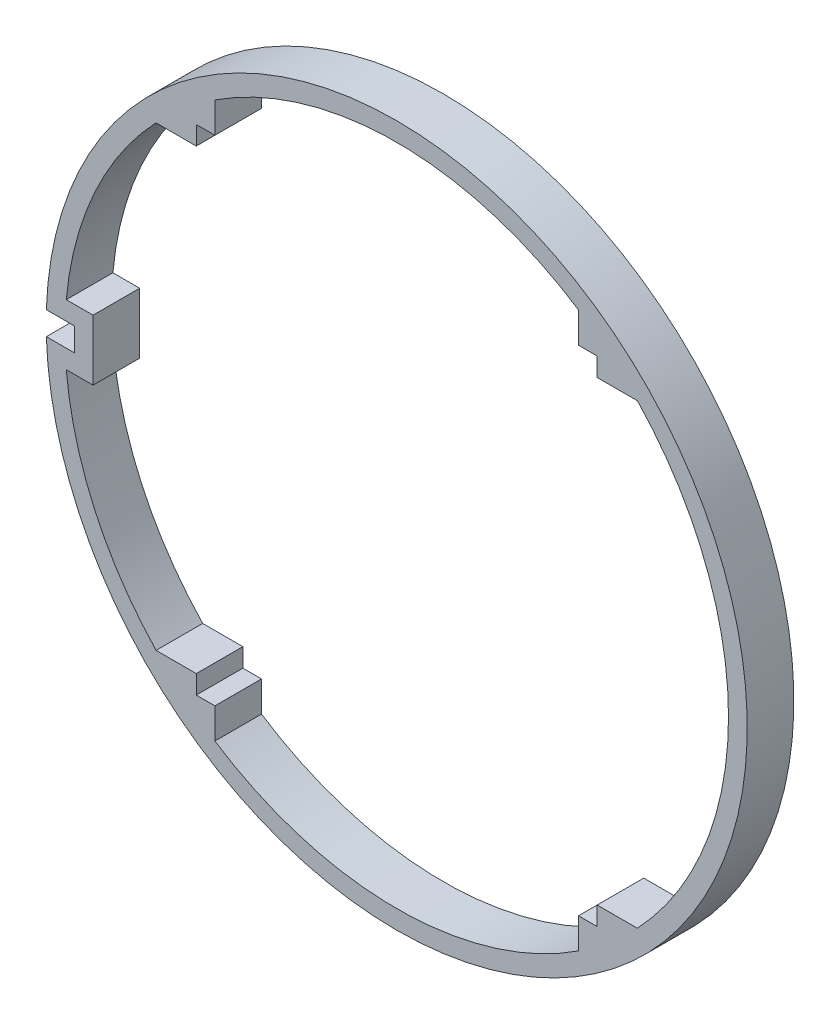
ISO-10303-21;
HEADER;
FILE_DESCRIPTION(('STEP AP214'),'2;1');
FILE_NAME('part.step','',(''),(''),'','','');
FILE_SCHEMA(('AUTOMOTIVE_DESIGN { 1 0 10303 214 1 1 1 1 }'));
ENDSEC;
DATA;
#1=APPLICATION_CONTEXT('core data for automotive mechanical design processes');
#2=APPLICATION_PROTOCOL_DEFINITION('international standard','automotive_design',2000,#1);
#3=PRODUCT_CONTEXT('',#1,'mechanical');
#4=PRODUCT('Part','Part','',(#3));
#5=PRODUCT_RELATED_PRODUCT_CATEGORY('part','',(#4));
#6=PRODUCT_DEFINITION_FORMATION('','',#4);
#7=PRODUCT_DEFINITION_CONTEXT('part definition',#1,'design');
#8=PRODUCT_DEFINITION('design','',#6,#7);
#9=PRODUCT_DEFINITION_SHAPE('','',#8);
#10=(LENGTH_UNIT() NAMED_UNIT(*) SI_UNIT(.MILLI.,.METRE.));
#11=(NAMED_UNIT(*) PLANE_ANGLE_UNIT() SI_UNIT($,.RADIAN.));
#12=(NAMED_UNIT(*) SI_UNIT($,.STERADIAN.) SOLID_ANGLE_UNIT());
#13=UNCERTAINTY_MEASURE_WITH_UNIT(LENGTH_MEASURE(1.E-05),#10,'distance_accuracy_value','');
#14=(GEOMETRIC_REPRESENTATION_CONTEXT(3) GLOBAL_UNCERTAINTY_ASSIGNED_CONTEXT((#13)) GLOBAL_UNIT_ASSIGNED_CONTEXT((#10,
#11,#12)) REPRESENTATION_CONTEXT('',''));
#15=CARTESIAN_POINT('',(0.,0.,0.));
#16=DIRECTION('',(0.,0.,1.));
#17=DIRECTION('',(1.,0.,0.));
#18=AXIS2_PLACEMENT_3D('',#15,#16,#17);
#19=CARTESIAN_POINT('',(0.,0.,10.));
#20=DIRECTION('',(0.,0.,-1.));
#21=DIRECTION('',(-1.,0.,0.));
#22=AXIS2_PLACEMENT_3D('',#19,#20,#21);
#23=CYLINDRICAL_SURFACE('',#22,71.1831196766441);
#24=CARTESIAN_POINT('',(0.,0.,0.));
#25=DIRECTION('',(0.,0.,1.));
#26=DIRECTION('',(1.,0.,0.));
#27=AXIS2_PLACEMENT_3D('',#24,#25,#26);
#28=CIRCLE('',#27,71.1831196766441);
#29=CARTESIAN_POINT('',(51.6197854605754,-49.0146332833737,0.));
#30=VERTEX_POINT('',#29);
#31=CARTESIAN_POINT('',(51.647559231169,48.985366716626,0.));
#32=VERTEX_POINT('',#31);
#33=EDGE_CURVE('E565',#30,#32,#28,.T.);
#34=ORIENTED_EDGE('',*,*,#33,.F.);
#35=DIRECTION('',(0.,0.,-1.));
#36=VECTOR('',#35,1.);
#37=CARTESIAN_POINT('',(51.6197854605754,-49.0146332833737,10.));
#38=LINE('',#37,#36);
#39=CARTESIAN_POINT('',(51.6197854605754,-49.0146332833737,10.));
#40=VERTEX_POINT('',#39);
#41=EDGE_CURVE('E12',#30,#40,#38,.F.);
#42=ORIENTED_EDGE('',*,*,#41,.T.);
#43=CARTESIAN_POINT('',(0.,0.,10.));
#44=DIRECTION('',(0.,0.,1.));
#45=DIRECTION('',(1.,0.,0.));
#46=AXIS2_PLACEMENT_3D('',#43,#44,#45);
#47=CIRCLE('',#46,71.1831196766441);
#48=CARTESIAN_POINT('',(51.647559231169,48.985366716626,10.));
#49=VERTEX_POINT('',#48);
#50=EDGE_CURVE('E582',#40,#49,#47,.T.);
#51=ORIENTED_EDGE('',*,*,#50,.T.);
#52=DIRECTION('',(0.,0.,-1.));
#53=VECTOR('',#52,1.);
#54=CARTESIAN_POINT('',(51.647559231169,48.985366716626,10.));
#55=LINE('',#54,#53);
#56=EDGE_CURVE('E532',#32,#49,#55,.F.);
#57=ORIENTED_EDGE('',*,*,#56,.F.);
#58=EDGE_LOOP('',(#34,#42,#51,#57));
#59=FACE_BOUND('',#58,.T.);
#60=ADVANCED_FACE('F76',(#59),#23,.F.);
#61=DIRECTION('',(0.,0.,-1.));
#62=VECTOR('',#61,1.);
#63=CARTESIAN_POINT('',(38.9999475409813,59.5486407796194,10.));
#64=LINE('',#63,#62);
#65=CARTESIAN_POINT('',(38.9999475409813,59.5486407796194,10.));
#66=VERTEX_POINT('',#65);
#67=CARTESIAN_POINT('',(38.9999475409813,59.5486407796194,0.));
#68=VERTEX_POINT('',#67);
#69=EDGE_CURVE('E101',#66,#68,#64,.T.);
#70=ORIENTED_EDGE('',*,*,#69,.F.);
#71=CARTESIAN_POINT('',(-39.0000524590183,59.5485720659467,10.));
#72=VERTEX_POINT('',#71);
#73=EDGE_CURVE('E577',#66,#72,#47,.T.);
#74=ORIENTED_EDGE('',*,*,#73,.T.);
#75=DIRECTION('',(0.,0.,-1.));
#76=VECTOR('',#75,1.);
#77=CARTESIAN_POINT('',(-39.0000524590183,59.5485720659467,10.));
#78=LINE('',#77,#76);
#79=CARTESIAN_POINT('',(-39.0000524590183,59.5485720659467,0.));
#80=VERTEX_POINT('',#79);
#81=EDGE_CURVE('E530',#80,#72,#78,.F.);
#82=ORIENTED_EDGE('',*,*,#81,.F.);
#83=EDGE_CURVE('E562',#68,#80,#28,.T.);
#84=ORIENTED_EDGE('',*,*,#83,.F.);
#85=EDGE_LOOP('',(#70,#74,#82,#84));
#86=FACE_BOUND('',#85,.T.);
#87=ADVANCED_FACE('F625',(#86),#23,.F.);
#88=DIRECTION('',(0.,0.,-1.));
#89=VECTOR('',#88,1.);
#90=CARTESIAN_POINT('',(-51.647559231169,48.985366716626,10.));
#91=LINE('',#90,#89);
#92=CARTESIAN_POINT('',(-51.647559231169,48.985366716626,10.));
#93=VERTEX_POINT('',#92);
#94=CARTESIAN_POINT('',(-51.647559231169,48.985366716626,0.));
#95=VERTEX_POINT('',#94);
#96=EDGE_CURVE('E91',#93,#95,#91,.T.);
#97=ORIENTED_EDGE('',*,*,#96,.F.);
#98=CARTESIAN_POINT('',(-70.8854542693566,6.50299161358703,10.));
#99=VERTEX_POINT('',#98);
#100=EDGE_CURVE('E269',#93,#99,#47,.T.);
#101=ORIENTED_EDGE('',*,*,#100,.T.);
#102=DIRECTION('',(0.,0.,-1.));
#103=VECTOR('',#102,1.);
#104=CARTESIAN_POINT('',(-70.8854542693566,6.50299161358703,10.));
#105=LINE('',#104,#103);
#106=CARTESIAN_POINT('',(-70.8854542693566,6.50299161358703,0.));
#107=VERTEX_POINT('',#106);
#108=EDGE_CURVE('E475',#99,#107,#105,.T.);
#109=ORIENTED_EDGE('',*,*,#108,.T.);
#110=EDGE_CURVE('E429',#95,#107,#28,.T.);
#111=ORIENTED_EDGE('',*,*,#110,.F.);
#112=EDGE_LOOP('',(#97,#101,#109,#111));
#113=FACE_BOUND('',#112,.T.);
#114=ADVANCED_FACE('F580',(#113),#23,.F.);
#115=DIRECTION('',(0.,0.,-1.));
#116=VECTOR('',#115,1.);
#117=CARTESIAN_POINT('',(38.9999475409813,-59.5486407796194,10.));
#118=LINE('',#117,#116);
#119=CARTESIAN_POINT('',(38.9999475409813,-59.5486407796194,0.));
#120=VERTEX_POINT('',#119);
#121=CARTESIAN_POINT('',(38.9999475409813,-59.5486407796194,10.));
#122=VERTEX_POINT('',#121);
#123=EDGE_CURVE('E88',#120,#122,#118,.F.);
#124=ORIENTED_EDGE('',*,*,#123,.F.);
#125=CARTESIAN_POINT('',(-39.0000524590183,-59.5485720659468,0.));
#126=VERTEX_POINT('',#125);
#127=EDGE_CURVE('E455',#126,#120,#28,.T.);
#128=ORIENTED_EDGE('',*,*,#127,.F.);
#129=DIRECTION('',(0.,0.,-1.));
#130=VECTOR('',#129,1.);
#131=CARTESIAN_POINT('',(-39.0000524590183,-59.5485720659468,10.));
#132=LINE('',#131,#130);
#133=CARTESIAN_POINT('',(-39.0000524590183,-59.5485720659468,10.));
#134=VERTEX_POINT('',#133);
#135=EDGE_CURVE('E522',#126,#134,#132,.F.);
#136=ORIENTED_EDGE('',*,*,#135,.T.);
#137=EDGE_CURVE('E436',#134,#122,#47,.T.);
#138=ORIENTED_EDGE('',*,*,#137,.T.);
#139=EDGE_LOOP('',(#124,#128,#136,#138));
#140=FACE_BOUND('',#139,.T.);
#141=ADVANCED_FACE('F590',(#140),#23,.F.);
#142=CARTESIAN_POINT('',(-70.8856259454272,-6.50111999769365,10.));
#143=VERTEX_POINT('',#142);
#144=CARTESIAN_POINT('',(-51.6197854605754,-49.0146332833737,10.));
#145=VERTEX_POINT('',#144);
#146=EDGE_CURVE('E431',#143,#145,#47,.T.);
#147=ORIENTED_EDGE('',*,*,#146,.T.);
#148=DIRECTION('',(0.,0.,-1.));
#149=VECTOR('',#148,1.);
#150=CARTESIAN_POINT('',(-51.6197854605754,-49.0146332833737,10.));
#151=LINE('',#150,#149);
#152=CARTESIAN_POINT('',(-51.6197854605754,-49.0146332833737,0.));
#153=VERTEX_POINT('',#152);
#154=EDGE_CURVE('E524',#145,#153,#151,.T.);
#155=ORIENTED_EDGE('',*,*,#154,.T.);
#156=CARTESIAN_POINT('',(-70.8856259454272,-6.50111999769365,0.));
#157=VERTEX_POINT('',#156);
#158=EDGE_CURVE('E450',#157,#153,#28,.T.);
#159=ORIENTED_EDGE('',*,*,#158,.F.);
#160=DIRECTION('',(0.,0.,-1.));
#161=VECTOR('',#160,1.);
#162=CARTESIAN_POINT('',(-70.8856259454272,-6.50111999769365,10.));
#163=LINE('',#162,#161);
#164=EDGE_CURVE('E446',#143,#157,#163,.T.);
#165=ORIENTED_EDGE('',*,*,#164,.F.);
#166=EDGE_LOOP('',(#147,#155,#159,#165));
#167=FACE_BOUND('',#166,.T.);
#168=ADVANCED_FACE('F603',(#167),#23,.F.);
#169=CARTESIAN_POINT('',(0.,0.,10.));
#170=DIRECTION('',(0.,0.,1.));
#171=DIRECTION('',(1.,0.,0.));
#172=AXIS2_PLACEMENT_3D('',#169,#170,#171);
#173=PLANE('',#172);
#174=ORIENTED_EDGE('',*,*,#73,.F.);
#175=DIRECTION('',(0.,-1.,0.));
#176=VECTOR('',#175,1.);
#177=CARTESIAN_POINT('',(38.9999475409813,61.804425072444,10.));
#178=LINE('',#177,#176);
#179=CARTESIAN_POINT('',(38.9999475409813,52.985366716626,10.));
#180=VERTEX_POINT('',#179);
#181=EDGE_CURVE('E330',#66,#180,#178,.T.);
#182=ORIENTED_EDGE('',*,*,#181,.T.);
#183=DIRECTION('',(1.,0.,0.));
#184=VECTOR('',#183,1.);
#185=CARTESIAN_POINT('',(38.9999475409813,52.985366716626,10.));
#186=LINE('',#185,#184);
#187=CARTESIAN_POINT('',(42.9999475409813,52.985366716626,10.));
#188=VERTEX_POINT('',#187);
#189=EDGE_CURVE('E289',#180,#188,#186,.T.);
#190=ORIENTED_EDGE('',*,*,#189,.T.);
#191=DIRECTION('',(0.,-1.,0.));
#192=VECTOR('',#191,1.);
#193=CARTESIAN_POINT('',(42.9999475409813,52.985366716626,10.));
#194=LINE('',#193,#192);
#195=CARTESIAN_POINT('',(42.9999475409813,48.985366716626,10.));
#196=VERTEX_POINT('',#195);
#197=EDGE_CURVE('E333',#188,#196,#194,.T.);
#198=ORIENTED_EDGE('',*,*,#197,.T.);
#199=DIRECTION('',(1.,0.,0.));
#200=VECTOR('',#199,1.);
#201=CARTESIAN_POINT('',(42.9999475409813,48.985366716626,10.));
#202=LINE('',#201,#200);
#203=EDGE_CURVE('E329',#196,#49,#202,.T.);
#204=ORIENTED_EDGE('',*,*,#203,.T.);
#205=ORIENTED_EDGE('',*,*,#50,.F.);
#206=DIRECTION('',(1.,0.,0.));
#207=VECTOR('',#206,1.);
#208=CARTESIAN_POINT('',(42.9999475409813,-49.0146332833737,10.));
#209=LINE('',#208,#207);
#210=CARTESIAN_POINT('',(42.9999475409813,-49.0146332833737,10.));
#211=VERTEX_POINT('',#210);
#212=EDGE_CURVE('E374',#211,#40,#209,.T.);
#213=ORIENTED_EDGE('',*,*,#212,.F.);
#214=DIRECTION('',(0.,1.,0.));
#215=VECTOR('',#214,1.);
#216=CARTESIAN_POINT('',(42.9999475409813,-53.0146332833737,10.));
#217=LINE('',#216,#215);
#218=CARTESIAN_POINT('',(42.9999475409813,-53.0146332833737,10.));
#219=VERTEX_POINT('',#218);
#220=EDGE_CURVE('E326',#219,#211,#217,.T.);
#221=ORIENTED_EDGE('',*,*,#220,.F.);
#222=DIRECTION('',(-1.,0.,0.));
#223=VECTOR('',#222,1.);
#224=CARTESIAN_POINT('',(42.9999475409813,-53.0146332833737,10.));
#225=LINE('',#224,#223);
#226=CARTESIAN_POINT('',(38.9999475409813,-53.0146332833737,10.));
#227=VERTEX_POINT('',#226);
#228=EDGE_CURVE('E368',#219,#227,#225,.T.);
#229=ORIENTED_EDGE('',*,*,#228,.T.);
#230=DIRECTION('',(0.,-1.,0.));
#231=VECTOR('',#230,1.);
#232=CARTESIAN_POINT('',(38.9999475409813,-53.0146332833737,10.));
#233=LINE('',#232,#231);
#234=EDGE_CURVE('E367',#227,#122,#233,.T.);
#235=ORIENTED_EDGE('',*,*,#234,.T.);
#236=ORIENTED_EDGE('',*,*,#137,.F.);
#237=DIRECTION('',(0.,-1.,0.));
#238=VECTOR('',#237,1.);
#239=CARTESIAN_POINT('',(-39.0000524590183,-53.0146332833737,10.));
#240=LINE('',#239,#238);
#241=CARTESIAN_POINT('',(-39.0000524590183,-53.0146332833737,10.));
#242=VERTEX_POINT('',#241);
#243=EDGE_CURVE('E413',#242,#134,#240,.T.);
#244=ORIENTED_EDGE('',*,*,#243,.F.);
#245=DIRECTION('',(1.,0.,0.));
#246=VECTOR('',#245,1.);
#247=CARTESIAN_POINT('',(-43.0000524590183,-53.0146332833737,10.));
#248=LINE('',#247,#246);
#249=CARTESIAN_POINT('',(-43.0000524590183,-53.0146332833737,10.));
#250=VERTEX_POINT('',#249);
#251=EDGE_CURVE('E300',#250,#242,#248,.T.);
#252=ORIENTED_EDGE('',*,*,#251,.F.);
#253=DIRECTION('',(0.,-1.,0.));
#254=VECTOR('',#253,1.);
#255=CARTESIAN_POINT('',(-43.0000524590183,-49.0146332833737,10.));
#256=LINE('',#255,#254);
#257=CARTESIAN_POINT('',(-43.0000524590183,-49.0146332833737,10.));
#258=VERTEX_POINT('',#257);
#259=EDGE_CURVE('E295',#258,#250,#256,.T.);
#260=ORIENTED_EDGE('',*,*,#259,.F.);
#261=DIRECTION('',(1.,0.,0.));
#262=VECTOR('',#261,1.);
#263=CARTESIAN_POINT('',(-54.5856090190077,-49.0146332833737,10.));
#264=LINE('',#263,#262);
#265=EDGE_CURVE('E402',#145,#258,#264,.T.);
#266=ORIENTED_EDGE('',*,*,#265,.F.);
#267=ORIENTED_EDGE('',*,*,#146,.F.);
#268=DIRECTION('',(1.,0.,0.));
#269=VECTOR('',#268,1.);
#270=CARTESIAN_POINT('',(-70.8856259454272,-6.50111999769365,10.));
#271=LINE('',#270,#269);
#272=CARTESIAN_POINT('',(-65.1381621719064,-6.50111999769365,10.));
#273=VERTEX_POINT('',#272);
#274=EDGE_CURVE('E444',#143,#273,#271,.T.);
#275=ORIENTED_EDGE('',*,*,#274,.T.);
#276=DIRECTION('',(0.,-1.,0.));
#277=VECTOR('',#276,1.);
#278=CARTESIAN_POINT('',(-65.1381621719064,6.50299161358703,10.));
#279=LINE('',#278,#277);
#280=CARTESIAN_POINT('',(-65.1381621719064,6.50299161358703,10.));
#281=VERTEX_POINT('',#280);
#282=EDGE_CURVE('E438',#281,#273,#279,.T.);
#283=ORIENTED_EDGE('',*,*,#282,.F.);
#284=DIRECTION('',(1.,0.,0.));
#285=VECTOR('',#284,1.);
#286=CARTESIAN_POINT('',(-70.8854542693566,6.50299161358703,10.));
#287=LINE('',#286,#285);
#288=EDGE_CURVE('E434',#99,#281,#287,.T.);
#289=ORIENTED_EDGE('',*,*,#288,.F.);
#290=ORIENTED_EDGE('',*,*,#100,.F.);
#291=DIRECTION('',(1.,0.,0.));
#292=VECTOR('',#291,1.);
#293=CARTESIAN_POINT('',(-54.5856090190077,48.985366716626,10.));
#294=LINE('',#293,#292);
#295=CARTESIAN_POINT('',(-43.0000524590183,48.985366716626,10.));
#296=VERTEX_POINT('',#295);
#297=EDGE_CURVE('E265',#93,#296,#294,.T.);
#298=ORIENTED_EDGE('',*,*,#297,.T.);
#299=DIRECTION('',(0.,1.,0.));
#300=VECTOR('',#299,1.);
#301=CARTESIAN_POINT('',(-43.0000524590183,48.985366716626,10.));
#302=LINE('',#301,#300);
#303=CARTESIAN_POINT('',(-43.0000524590183,52.985366716626,10.));
#304=VERTEX_POINT('',#303);
#305=EDGE_CURVE('E268',#296,#304,#302,.T.);
#306=ORIENTED_EDGE('',*,*,#305,.T.);
#307=DIRECTION('',(1.,0.,0.));
#308=VECTOR('',#307,1.);
#309=CARTESIAN_POINT('',(-43.0000524590183,52.985366716626,10.));
#310=LINE('',#309,#308);
#311=CARTESIAN_POINT('',(-39.0000524590183,52.985366716626,10.));
#312=VERTEX_POINT('',#311);
#313=EDGE_CURVE('E291',#304,#312,#310,.T.);
#314=ORIENTED_EDGE('',*,*,#313,.T.);
#315=DIRECTION('',(0.,1.,0.));
#316=VECTOR('',#315,1.);
#317=CARTESIAN_POINT('',(-39.0000524590183,52.985366716626,10.));
#318=LINE('',#317,#316);
#319=EDGE_CURVE('E272',#312,#72,#318,.T.);
#320=ORIENTED_EDGE('',*,*,#319,.T.);
#321=EDGE_LOOP('',(#174,#182,#190,#198,#204,#205,#213,#221,#229,#235,#236,#244,#252,#260,#266,
#267,#275,#283,#289,#290,#298,#306,#314,#320));
#322=FACE_BOUND('',#321,.T.);
#323=CARTESIAN_POINT('',(0.,0.,10.));
#324=DIRECTION('',(0.,0.,1.));
#325=DIRECTION('',(1.,0.,0.));
#326=AXIS2_PLACEMENT_3D('',#323,#324,#325);
#327=CIRCLE('',#326,75.2);
#328=CARTESIAN_POINT('',(-75.1584224492808,-2.5003069682441,10.));
#329=VERTEX_POINT('',#328);
#330=CARTESIAN_POINT('',(-75.1584242496937,2.50025284782396,10.));
#331=VERTEX_POINT('',#330);
#332=EDGE_CURVE('E479',#329,#331,#327,.T.);
#333=ORIENTED_EDGE('',*,*,#332,.T.);
#334=DIRECTION('',(1.,0.,0.));
#335=VECTOR('',#334,1.);
#336=CARTESIAN_POINT('',(-75.1584242496937,2.50025284782396,10.));
#337=LINE('',#336,#335);
#338=CARTESIAN_POINT('',(-69.1392052731785,2.50025284782396,10.));
#339=VERTEX_POINT('',#338);
#340=EDGE_CURVE('E483',#331,#339,#337,.T.);
#341=ORIENTED_EDGE('',*,*,#340,.T.);
#342=DIRECTION('',(0.,1.,0.));
#343=VECTOR('',#342,1.);
#344=CARTESIAN_POINT('',(-69.1392052731785,-2.5003069682441,10.));
#345=LINE('',#344,#343);
#346=CARTESIAN_POINT('',(-69.1392052731785,-2.5003069682441,10.));
#347=VERTEX_POINT('',#346);
#348=EDGE_CURVE('E490',#347,#339,#345,.T.);
#349=ORIENTED_EDGE('',*,*,#348,.F.);
#350=DIRECTION('',(1.,0.,0.));
#351=VECTOR('',#350,1.);
#352=CARTESIAN_POINT('',(-71.1392052731785,-2.5003069682441,10.));
#353=LINE('',#352,#351);
#354=EDGE_CURVE('E491',#329,#347,#353,.T.);
#355=ORIENTED_EDGE('',*,*,#354,.F.);
#356=EDGE_LOOP('',(#333,#341,#349,#355));
#357=FACE_BOUND('',#356,.T.);
#358=ADVANCED_FACE('F262',(#322,#357),#173,.T.);
#359=CARTESIAN_POINT('',(0.,0.,0.));
#360=DIRECTION('',(0.,0.,1.));
#361=DIRECTION('',(1.,0.,0.));
#362=AXIS2_PLACEMENT_3D('',#359,#360,#361);
#363=PLANE('',#362);
#364=ORIENTED_EDGE('',*,*,#33,.T.);
#365=DIRECTION('',(1.,0.,0.));
#366=VECTOR('',#365,1.);
#367=CARTESIAN_POINT('',(42.9999475409813,48.985366716626,0.));
#368=LINE('',#367,#366);
#369=CARTESIAN_POINT('',(42.9999475409813,48.985366716626,0.));
#370=VERTEX_POINT('',#369);
#371=EDGE_CURVE('E343',#370,#32,#368,.T.);
#372=ORIENTED_EDGE('',*,*,#371,.F.);
#373=DIRECTION('',(0.,-1.,0.));
#374=VECTOR('',#373,1.);
#375=CARTESIAN_POINT('',(42.9999475409813,52.985366716626,0.));
#376=LINE('',#375,#374);
#377=CARTESIAN_POINT('',(42.9999475409813,52.985366716626,0.));
#378=VERTEX_POINT('',#377);
#379=EDGE_CURVE('E346',#378,#370,#376,.T.);
#380=ORIENTED_EDGE('',*,*,#379,.F.);
#381=DIRECTION('',(1.,0.,0.));
#382=VECTOR('',#381,1.);
#383=CARTESIAN_POINT('',(38.9999475409813,52.985366716626,0.));
#384=LINE('',#383,#382);
#385=CARTESIAN_POINT('',(38.9999475409813,52.985366716626,0.));
#386=VERTEX_POINT('',#385);
#387=EDGE_CURVE('E332',#386,#378,#384,.T.);
#388=ORIENTED_EDGE('',*,*,#387,.F.);
#389=DIRECTION('',(0.,-1.,0.));
#390=VECTOR('',#389,1.);
#391=CARTESIAN_POINT('',(38.9999475409813,61.804425072444,0.));
#392=LINE('',#391,#390);
#393=EDGE_CURVE('E318',#68,#386,#392,.T.);
#394=ORIENTED_EDGE('',*,*,#393,.F.);
#395=ORIENTED_EDGE('',*,*,#83,.T.);
#396=DIRECTION('',(0.,1.,0.));
#397=VECTOR('',#396,1.);
#398=CARTESIAN_POINT('',(-39.0000524590183,52.985366716626,0.));
#399=LINE('',#398,#397);
#400=CARTESIAN_POINT('',(-39.0000524590183,52.985366716626,0.));
#401=VERTEX_POINT('',#400);
#402=EDGE_CURVE('E302',#401,#80,#399,.T.);
#403=ORIENTED_EDGE('',*,*,#402,.F.);
#404=DIRECTION('',(1.,0.,0.));
#405=VECTOR('',#404,1.);
#406=CARTESIAN_POINT('',(-43.0000524590183,52.985366716626,0.));
#407=LINE('',#406,#405);
#408=CARTESIAN_POINT('',(-43.0000524590183,52.985366716626,0.));
#409=VERTEX_POINT('',#408);
#410=EDGE_CURVE('E310',#409,#401,#407,.T.);
#411=ORIENTED_EDGE('',*,*,#410,.F.);
#412=DIRECTION('',(0.,1.,0.));
#413=VECTOR('',#412,1.);
#414=CARTESIAN_POINT('',(-43.0000524590183,48.985366716626,0.));
#415=LINE('',#414,#413);
#416=CARTESIAN_POINT('',(-43.0000524590183,48.985366716626,0.));
#417=VERTEX_POINT('',#416);
#418=EDGE_CURVE('E273',#417,#409,#415,.T.);
#419=ORIENTED_EDGE('',*,*,#418,.F.);
#420=DIRECTION('',(1.,0.,0.));
#421=VECTOR('',#420,1.);
#422=CARTESIAN_POINT('',(-54.5856090190077,48.985366716626,0.));
#423=LINE('',#422,#421);
#424=EDGE_CURVE('E278',#95,#417,#423,.T.);
#425=ORIENTED_EDGE('',*,*,#424,.F.);
#426=ORIENTED_EDGE('',*,*,#110,.T.);
#427=DIRECTION('',(1.,0.,0.));
#428=VECTOR('',#427,1.);
#429=CARTESIAN_POINT('',(-70.8854542693566,6.50299161358703,0.));
#430=LINE('',#429,#428);
#431=CARTESIAN_POINT('',(-65.1381621719064,6.50299161358703,0.));
#432=VERTEX_POINT('',#431);
#433=EDGE_CURVE('E451',#107,#432,#430,.T.);
#434=ORIENTED_EDGE('',*,*,#433,.T.);
#435=DIRECTION('',(0.,-1.,0.));
#436=VECTOR('',#435,1.);
#437=CARTESIAN_POINT('',(-65.1381621719064,6.50299161358703,0.));
#438=LINE('',#437,#436);
#439=CARTESIAN_POINT('',(-65.1381621719064,-6.50111999769365,0.));
#440=VERTEX_POINT('',#439);
#441=EDGE_CURVE('E460',#432,#440,#438,.T.);
#442=ORIENTED_EDGE('',*,*,#441,.T.);
#443=DIRECTION('',(1.,0.,0.));
#444=VECTOR('',#443,1.);
#445=CARTESIAN_POINT('',(-70.8856259454272,-6.50111999769365,0.));
#446=LINE('',#445,#444);
#447=EDGE_CURVE('E464',#157,#440,#446,.T.);
#448=ORIENTED_EDGE('',*,*,#447,.F.);
#449=ORIENTED_EDGE('',*,*,#158,.T.);
#450=DIRECTION('',(1.,0.,0.));
#451=VECTOR('',#450,1.);
#452=CARTESIAN_POINT('',(-54.5856090190077,-49.0146332833737,0.));
#453=LINE('',#452,#451);
#454=CARTESIAN_POINT('',(-43.0000524590183,-49.0146332833737,0.));
#455=VERTEX_POINT('',#454);
#456=EDGE_CURVE('E410',#153,#455,#453,.T.);
#457=ORIENTED_EDGE('',*,*,#456,.T.);
#458=DIRECTION('',(0.,-1.,0.));
#459=VECTOR('',#458,1.);
#460=CARTESIAN_POINT('',(-43.0000524590183,-49.0146332833737,0.));
#461=LINE('',#460,#459);
#462=CARTESIAN_POINT('',(-43.0000524590183,-53.0146332833737,0.));
#463=VERTEX_POINT('',#462);
#464=EDGE_CURVE('E399',#455,#463,#461,.T.);
#465=ORIENTED_EDGE('',*,*,#464,.T.);
#466=DIRECTION('',(1.,0.,0.));
#467=VECTOR('',#466,1.);
#468=CARTESIAN_POINT('',(-43.0000524590183,-53.0146332833737,0.));
#469=LINE('',#468,#467);
#470=CARTESIAN_POINT('',(-39.0000524590183,-53.0146332833737,0.));
#471=VERTEX_POINT('',#470);
#472=EDGE_CURVE('E397',#463,#471,#469,.T.);
#473=ORIENTED_EDGE('',*,*,#472,.T.);
#474=DIRECTION('',(0.,-1.,0.));
#475=VECTOR('',#474,1.);
#476=CARTESIAN_POINT('',(-39.0000524590183,-53.0146332833737,0.));
#477=LINE('',#476,#475);
#478=EDGE_CURVE('E404',#471,#126,#477,.T.);
#479=ORIENTED_EDGE('',*,*,#478,.T.);
#480=ORIENTED_EDGE('',*,*,#127,.T.);
#481=DIRECTION('',(0.,-1.,0.));
#482=VECTOR('',#481,1.);
#483=CARTESIAN_POINT('',(38.9999475409813,-53.0146332833737,0.));
#484=LINE('',#483,#482);
#485=CARTESIAN_POINT('',(38.9999475409813,-53.0146332833737,0.));
#486=VERTEX_POINT('',#485);
#487=EDGE_CURVE('E384',#486,#120,#484,.T.);
#488=ORIENTED_EDGE('',*,*,#487,.F.);
#489=DIRECTION('',(-1.,0.,0.));
#490=VECTOR('',#489,1.);
#491=CARTESIAN_POINT('',(42.9999475409813,-53.0146332833737,0.));
#492=LINE('',#491,#490);
#493=CARTESIAN_POINT('',(42.9999475409813,-53.0146332833737,0.));
#494=VERTEX_POINT('',#493);
#495=EDGE_CURVE('E364',#494,#486,#492,.T.);
#496=ORIENTED_EDGE('',*,*,#495,.F.);
#497=DIRECTION('',(0.,1.,0.));
#498=VECTOR('',#497,1.);
#499=CARTESIAN_POINT('',(42.9999475409813,-53.0146332833737,0.));
#500=LINE('',#499,#498);
#501=CARTESIAN_POINT('',(42.9999475409813,-49.0146332833737,0.));
#502=VERTEX_POINT('',#501);
#503=EDGE_CURVE('E371',#494,#502,#500,.T.);
#504=ORIENTED_EDGE('',*,*,#503,.T.);
#505=DIRECTION('',(1.,0.,0.));
#506=VECTOR('',#505,1.);
#507=CARTESIAN_POINT('',(42.9999475409813,-49.0146332833737,0.));
#508=LINE('',#507,#506);
#509=EDGE_CURVE('E386',#502,#30,#508,.T.);
#510=ORIENTED_EDGE('',*,*,#509,.T.);
#511=EDGE_LOOP('',(#364,#372,#380,#388,#394,#395,#403,#411,#419,#425,#426,#434,#442,#448,#449,
#457,#465,#473,#479,#480,#488,#496,#504,#510));
#512=FACE_BOUND('',#511,.T.);
#513=CARTESIAN_POINT('',(0.,0.,0.));
#514=DIRECTION('',(0.,0.,1.));
#515=DIRECTION('',(1.,0.,0.));
#516=AXIS2_PLACEMENT_3D('',#513,#514,#515);
#517=CIRCLE('',#516,75.2);
#518=CARTESIAN_POINT('',(-75.1584224492808,-2.5003069682441,0.));
#519=VERTEX_POINT('',#518);
#520=CARTESIAN_POINT('',(-75.1584242496937,2.50025284782396,0.));
#521=VERTEX_POINT('',#520);
#522=EDGE_CURVE('E476',#519,#521,#517,.T.);
#523=ORIENTED_EDGE('',*,*,#522,.F.);
#524=DIRECTION('',(1.,0.,0.));
#525=VECTOR('',#524,1.);
#526=CARTESIAN_POINT('',(-75.1584224492808,-2.5003069682441,0.));
#527=LINE('',#526,#525);
#528=CARTESIAN_POINT('',(-69.1392052731785,-2.5003069682441,0.));
#529=VERTEX_POINT('',#528);
#530=EDGE_CURVE('E482',#519,#529,#527,.T.);
#531=ORIENTED_EDGE('',*,*,#530,.T.);
#532=DIRECTION('',(0.,1.,0.));
#533=VECTOR('',#532,1.);
#534=CARTESIAN_POINT('',(-69.1392052731785,-2.5003069682441,0.));
#535=LINE('',#534,#533);
#536=CARTESIAN_POINT('',(-69.1392052731785,2.50025284782396,0.));
#537=VERTEX_POINT('',#536);
#538=EDGE_CURVE('E501',#529,#537,#535,.T.);
#539=ORIENTED_EDGE('',*,*,#538,.T.);
#540=DIRECTION('',(-1.,0.,0.));
#541=VECTOR('',#540,1.);
#542=CARTESIAN_POINT('',(-69.1392052731785,2.50025284782396,0.));
#543=LINE('',#542,#541);
#544=EDGE_CURVE('E496',#537,#521,#543,.T.);
#545=ORIENTED_EDGE('',*,*,#544,.T.);
#546=EDGE_LOOP('',(#523,#531,#539,#545));
#547=FACE_BOUND('',#546,.T.);
#548=ADVANCED_FACE('F558',(#512,#547),#363,.F.);
#549=CARTESIAN_POINT('',(0.,0.,10.));
#550=DIRECTION('',(0.,0.,-1.));
#551=DIRECTION('',(-1.,0.,0.));
#552=AXIS2_PLACEMENT_3D('',#549,#550,#551);
#553=CYLINDRICAL_SURFACE('',#552,75.2);
#554=ORIENTED_EDGE('',*,*,#522,.T.);
#555=DIRECTION('',(0.,0.,-1.));
#556=VECTOR('',#555,1.);
#557=CARTESIAN_POINT('',(-75.1584242496937,2.50025284782396,10.));
#558=LINE('',#557,#556);
#559=EDGE_CURVE('E516',#331,#521,#558,.T.);
#560=ORIENTED_EDGE('',*,*,#559,.F.);
#561=ORIENTED_EDGE('',*,*,#332,.F.);
#562=DIRECTION('',(0.,0.,-1.));
#563=VECTOR('',#562,1.);
#564=CARTESIAN_POINT('',(-75.1584224492808,-2.5003069682441,10.));
#565=LINE('',#564,#563);
#566=EDGE_CURVE('E494',#329,#519,#565,.T.);
#567=ORIENTED_EDGE('',*,*,#566,.T.);
#568=EDGE_LOOP('',(#554,#560,#561,#567));
#569=FACE_BOUND('',#568,.T.);
#570=ADVANCED_FACE('F78',(#569),#553,.T.);
#571=CARTESIAN_POINT('',(-69.1392052731785,2.50025284782396,10.));
#572=DIRECTION('',(0.,-1.,0.));
#573=DIRECTION('',(1.,0.,0.));
#574=AXIS2_PLACEMENT_3D('',#571,#572,#573);
#575=PLANE('',#574);
#576=ORIENTED_EDGE('',*,*,#544,.F.);
#577=DIRECTION('',(0.,0.,-1.));
#578=VECTOR('',#577,1.);
#579=CARTESIAN_POINT('',(-69.1392052731785,2.50025284782396,10.));
#580=LINE('',#579,#578);
#581=EDGE_CURVE('E514',#339,#537,#580,.T.);
#582=ORIENTED_EDGE('',*,*,#581,.F.);
#583=ORIENTED_EDGE('',*,*,#340,.F.);
#584=ORIENTED_EDGE('',*,*,#559,.T.);
#585=EDGE_LOOP('',(#576,#582,#583,#584));
#586=FACE_BOUND('',#585,.T.);
#587=ADVANCED_FACE('F858',(#586),#575,.T.);
#588=CARTESIAN_POINT('',(-69.1392052731785,-2.5003069682441,10.));
#589=DIRECTION('',(-1.,0.,0.));
#590=DIRECTION('',(0.,0.,1.));
#591=AXIS2_PLACEMENT_3D('',#588,#589,#590);
#592=PLANE('',#591);
#593=ORIENTED_EDGE('',*,*,#538,.F.);
#594=DIRECTION('',(0.,0.,-1.));
#595=VECTOR('',#594,1.);
#596=CARTESIAN_POINT('',(-69.1392052731785,-2.5003069682441,10.));
#597=LINE('',#596,#595);
#598=EDGE_CURVE('E507',#347,#529,#597,.T.);
#599=ORIENTED_EDGE('',*,*,#598,.F.);
#600=ORIENTED_EDGE('',*,*,#348,.T.);
#601=ORIENTED_EDGE('',*,*,#581,.T.);
#602=EDGE_LOOP('',(#593,#599,#600,#601));
#603=FACE_BOUND('',#602,.T.);
#604=ADVANCED_FACE('F862',(#603),#592,.T.);
#605=CARTESIAN_POINT('',(-75.1584224492808,-2.5003069682441,10.));
#606=DIRECTION('',(0.,1.,0.));
#607=DIRECTION('',(-1.,0.,0.));
#608=AXIS2_PLACEMENT_3D('',#605,#606,#607);
#609=PLANE('',#608);
#610=ORIENTED_EDGE('',*,*,#530,.F.);
#611=ORIENTED_EDGE('',*,*,#566,.F.);
#612=ORIENTED_EDGE('',*,*,#354,.T.);
#613=ORIENTED_EDGE('',*,*,#598,.T.);
#614=EDGE_LOOP('',(#610,#611,#612,#613));
#615=FACE_BOUND('',#614,.T.);
#616=ADVANCED_FACE('F618',(#615),#609,.T.);
#617=CARTESIAN_POINT('',(-70.8854542693566,6.50299161358703,10.));
#618=DIRECTION('',(0.,1.,0.));
#619=DIRECTION('',(-1.,0.,0.));
#620=AXIS2_PLACEMENT_3D('',#617,#618,#619);
#621=PLANE('',#620);
#622=ORIENTED_EDGE('',*,*,#433,.F.);
#623=ORIENTED_EDGE('',*,*,#108,.F.);
#624=ORIENTED_EDGE('',*,*,#288,.T.);
#625=DIRECTION('',(0.,0.,-1.));
#626=VECTOR('',#625,1.);
#627=CARTESIAN_POINT('',(-65.1381621719064,6.50299161358703,10.));
#628=LINE('',#627,#626);
#629=EDGE_CURVE('E473',#281,#432,#628,.T.);
#630=ORIENTED_EDGE('',*,*,#629,.T.);
#631=EDGE_LOOP('',(#622,#623,#624,#630));
#632=FACE_BOUND('',#631,.T.);
#633=ADVANCED_FACE('F572',(#632),#621,.T.);
#634=CARTESIAN_POINT('',(-65.1381621719064,6.50299161358703,10.));
#635=DIRECTION('',(1.,0.,0.));
#636=DIRECTION('',(0.,0.,-1.));
#637=AXIS2_PLACEMENT_3D('',#634,#635,#636);
#638=PLANE('',#637);
#639=ORIENTED_EDGE('',*,*,#441,.F.);
#640=ORIENTED_EDGE('',*,*,#629,.F.);
#641=ORIENTED_EDGE('',*,*,#282,.T.);
#642=DIRECTION('',(0.,0.,-1.));
#643=VECTOR('',#642,1.);
#644=CARTESIAN_POINT('',(-65.1381621719064,-6.50111999769365,10.));
#645=LINE('',#644,#643);
#646=EDGE_CURVE('E470',#273,#440,#645,.T.);
#647=ORIENTED_EDGE('',*,*,#646,.T.);
#648=EDGE_LOOP('',(#639,#640,#641,#647));
#649=FACE_BOUND('',#648,.T.);
#650=ADVANCED_FACE('F614',(#649),#638,.T.);
#651=CARTESIAN_POINT('',(-70.8856259454272,-6.50111999769365,10.));
#652=DIRECTION('',(0.,1.,0.));
#653=DIRECTION('',(-1.,0.,0.));
#654=AXIS2_PLACEMENT_3D('',#651,#652,#653);
#655=PLANE('',#654);
#656=ORIENTED_EDGE('',*,*,#447,.T.);
#657=ORIENTED_EDGE('',*,*,#646,.F.);
#658=ORIENTED_EDGE('',*,*,#274,.F.);
#659=ORIENTED_EDGE('',*,*,#164,.T.);
#660=EDGE_LOOP('',(#656,#657,#658,#659));
#661=FACE_BOUND('',#660,.T.);
#662=ADVANCED_FACE('F609',(#661),#655,.F.);
#663=CARTESIAN_POINT('',(-43.0000524590183,-49.0146332833737,0.));
#664=DIRECTION('',(-1.,0.,0.));
#665=DIRECTION('',(0.,0.,1.));
#666=AXIS2_PLACEMENT_3D('',#663,#664,#665);
#667=PLANE('',#666);
#668=ORIENTED_EDGE('',*,*,#259,.T.);
#669=DIRECTION('',(0.,0.,1.));
#670=VECTOR('',#669,1.);
#671=CARTESIAN_POINT('',(-43.0000524590183,-53.0146332833737,0.));
#672=LINE('',#671,#670);
#673=EDGE_CURVE('E426',#463,#250,#672,.T.);
#674=ORIENTED_EDGE('',*,*,#673,.F.);
#675=ORIENTED_EDGE('',*,*,#464,.F.);
#676=DIRECTION('',(0.,0.,1.));
#677=VECTOR('',#676,1.);
#678=CARTESIAN_POINT('',(-43.0000524590183,-49.0146332833737,0.));
#679=LINE('',#678,#677);
#680=EDGE_CURVE('E407',#455,#258,#679,.T.);
#681=ORIENTED_EDGE('',*,*,#680,.T.);
#682=EDGE_LOOP('',(#668,#674,#675,#681));
#683=FACE_BOUND('',#682,.T.);
#684=ADVANCED_FACE('F598',(#683),#667,.F.);
#685=CARTESIAN_POINT('',(-43.0000524590183,-53.0146332833737,0.));
#686=DIRECTION('',(0.,-1.,0.));
#687=DIRECTION('',(0.,0.,-1.));
#688=AXIS2_PLACEMENT_3D('',#685,#686,#687);
#689=PLANE('',#688);
#690=ORIENTED_EDGE('',*,*,#251,.T.);
#691=DIRECTION('',(0.,0.,1.));
#692=VECTOR('',#691,1.);
#693=CARTESIAN_POINT('',(-39.0000524590183,-53.0146332833737,0.));
#694=LINE('',#693,#692);
#695=EDGE_CURVE('E425',#471,#242,#694,.T.);
#696=ORIENTED_EDGE('',*,*,#695,.F.);
#697=ORIENTED_EDGE('',*,*,#472,.F.);
#698=ORIENTED_EDGE('',*,*,#673,.T.);
#699=EDGE_LOOP('',(#690,#696,#697,#698));
#700=FACE_BOUND('',#699,.T.);
#701=ADVANCED_FACE('F594',(#700),#689,.F.);
#702=CARTESIAN_POINT('',(-39.0000524590183,-53.0146332833737,0.));
#703=DIRECTION('',(-1.,0.,0.));
#704=DIRECTION('',(0.,0.,1.));
#705=AXIS2_PLACEMENT_3D('',#702,#703,#704);
#706=PLANE('',#705);
#707=ORIENTED_EDGE('',*,*,#135,.F.);
#708=ORIENTED_EDGE('',*,*,#478,.F.);
#709=ORIENTED_EDGE('',*,*,#695,.T.);
#710=ORIENTED_EDGE('',*,*,#243,.T.);
#711=EDGE_LOOP('',(#707,#708,#709,#710));
#712=FACE_BOUND('',#711,.T.);
#713=ADVANCED_FACE('F589',(#712),#706,.F.);
#714=CARTESIAN_POINT('',(-54.5856090190077,-49.0146332833737,0.));
#715=DIRECTION('',(0.,-1.,0.));
#716=DIRECTION('',(0.,0.,-1.));
#717=AXIS2_PLACEMENT_3D('',#714,#715,#716);
#718=PLANE('',#717);
#719=ORIENTED_EDGE('',*,*,#154,.F.);
#720=ORIENTED_EDGE('',*,*,#265,.T.);
#721=ORIENTED_EDGE('',*,*,#680,.F.);
#722=ORIENTED_EDGE('',*,*,#456,.F.);
#723=EDGE_LOOP('',(#719,#720,#721,#722));
#724=FACE_BOUND('',#723,.T.);
#725=ADVANCED_FACE('F601',(#724),#718,.F.);
#726=CARTESIAN_POINT('',(-43.0000524590183,48.985366716626,0.));
#727=DIRECTION('',(1.,0.,0.));
#728=DIRECTION('',(0.,0.,-1.));
#729=AXIS2_PLACEMENT_3D('',#726,#727,#728);
#730=PLANE('',#729);
#731=ORIENTED_EDGE('',*,*,#305,.F.);
#732=DIRECTION('',(0.,0.,1.));
#733=VECTOR('',#732,1.);
#734=CARTESIAN_POINT('',(-43.0000524590183,48.985366716626,0.));
#735=LINE('',#734,#733);
#736=EDGE_CURVE('E280',#417,#296,#735,.T.);
#737=ORIENTED_EDGE('',*,*,#736,.F.);
#738=ORIENTED_EDGE('',*,*,#418,.T.);
#739=DIRECTION('',(0.,0.,1.));
#740=VECTOR('',#739,1.);
#741=CARTESIAN_POINT('',(-43.0000524590183,52.985366716626,0.));
#742=LINE('',#741,#740);
#743=EDGE_CURVE('E288',#409,#304,#742,.T.);
#744=ORIENTED_EDGE('',*,*,#743,.T.);
#745=EDGE_LOOP('',(#731,#737,#738,#744));
#746=FACE_BOUND('',#745,.T.);
#747=ADVANCED_FACE('F290',(#746),#730,.T.);
#748=CARTESIAN_POINT('',(-54.5856090190077,48.985366716626,0.));
#749=DIRECTION('',(0.,-1.,0.));
#750=DIRECTION('',(0.,0.,-1.));
#751=AXIS2_PLACEMENT_3D('',#748,#749,#750);
#752=PLANE('',#751);
#753=ORIENTED_EDGE('',*,*,#297,.F.);
#754=ORIENTED_EDGE('',*,*,#96,.T.);
#755=ORIENTED_EDGE('',*,*,#424,.T.);
#756=ORIENTED_EDGE('',*,*,#736,.T.);
#757=EDGE_LOOP('',(#753,#754,#755,#756));
#758=FACE_BOUND('',#757,.T.);
#759=ADVANCED_FACE('F279',(#758),#752,.T.);
#760=CARTESIAN_POINT('',(-39.0000524590183,52.985366716626,0.));
#761=DIRECTION('',(1.,0.,0.));
#762=DIRECTION('',(0.,0.,-1.));
#763=AXIS2_PLACEMENT_3D('',#760,#761,#762);
#764=PLANE('',#763);
#765=ORIENTED_EDGE('',*,*,#402,.T.);
#766=ORIENTED_EDGE('',*,*,#81,.T.);
#767=ORIENTED_EDGE('',*,*,#319,.F.);
#768=DIRECTION('',(0.,0.,1.));
#769=VECTOR('',#768,1.);
#770=CARTESIAN_POINT('',(-39.0000524590183,52.985366716626,0.));
#771=LINE('',#770,#769);
#772=EDGE_CURVE('E282',#401,#312,#771,.T.);
#773=ORIENTED_EDGE('',*,*,#772,.F.);
#774=EDGE_LOOP('',(#765,#766,#767,#773));
#775=FACE_BOUND('',#774,.T.);
#776=ADVANCED_FACE('F733',(#775),#764,.T.);
#777=CARTESIAN_POINT('',(-43.0000524590183,52.985366716626,0.));
#778=DIRECTION('',(0.,-1.,0.));
#779=DIRECTION('',(0.,0.,-1.));
#780=AXIS2_PLACEMENT_3D('',#777,#778,#779);
#781=PLANE('',#780);
#782=ORIENTED_EDGE('',*,*,#313,.F.);
#783=ORIENTED_EDGE('',*,*,#743,.F.);
#784=ORIENTED_EDGE('',*,*,#410,.T.);
#785=ORIENTED_EDGE('',*,*,#772,.T.);
#786=EDGE_LOOP('',(#782,#783,#784,#785));
#787=FACE_BOUND('',#786,.T.);
#788=ADVANCED_FACE('F743',(#787),#781,.T.);
#789=CARTESIAN_POINT('',(38.9999475409813,52.985366716626,0.));
#790=DIRECTION('',(0.,-1.,0.));
#791=DIRECTION('',(0.,0.,-1.));
#792=AXIS2_PLACEMENT_3D('',#789,#790,#791);
#793=PLANE('',#792);
#794=ORIENTED_EDGE('',*,*,#189,.F.);
#795=DIRECTION('',(0.,0.,1.));
#796=VECTOR('',#795,1.);
#797=CARTESIAN_POINT('',(38.9999475409813,52.985366716626,0.));
#798=LINE('',#797,#796);
#799=EDGE_CURVE('E325',#386,#180,#798,.T.);
#800=ORIENTED_EDGE('',*,*,#799,.F.);
#801=ORIENTED_EDGE('',*,*,#387,.T.);
#802=DIRECTION('',(0.,0.,1.));
#803=VECTOR('',#802,1.);
#804=CARTESIAN_POINT('',(42.9999475409813,52.985366716626,0.));
#805=LINE('',#804,#803);
#806=EDGE_CURVE('E312',#378,#188,#805,.T.);
#807=ORIENTED_EDGE('',*,*,#806,.T.);
#808=EDGE_LOOP('',(#794,#800,#801,#807));
#809=FACE_BOUND('',#808,.T.);
#810=ADVANCED_FACE('F754',(#809),#793,.T.);
#811=CARTESIAN_POINT('',(38.9999475409813,61.804425072444,0.));
#812=DIRECTION('',(-1.,0.,0.));
#813=DIRECTION('',(0.,0.,1.));
#814=AXIS2_PLACEMENT_3D('',#811,#812,#813);
#815=PLANE('',#814);
#816=ORIENTED_EDGE('',*,*,#181,.F.);
#817=ORIENTED_EDGE('',*,*,#69,.T.);
#818=ORIENTED_EDGE('',*,*,#393,.T.);
#819=ORIENTED_EDGE('',*,*,#799,.T.);
#820=EDGE_LOOP('',(#816,#817,#818,#819));
#821=FACE_BOUND('',#820,.T.);
#822=ADVANCED_FACE('F762',(#821),#815,.T.);
#823=CARTESIAN_POINT('',(42.9999475409813,48.985366716626,0.));
#824=DIRECTION('',(0.,-1.,0.));
#825=DIRECTION('',(0.,0.,-1.));
#826=AXIS2_PLACEMENT_3D('',#823,#824,#825);
#827=PLANE('',#826);
#828=ORIENTED_EDGE('',*,*,#371,.T.);
#829=ORIENTED_EDGE('',*,*,#56,.T.);
#830=ORIENTED_EDGE('',*,*,#203,.F.);
#831=DIRECTION('',(0.,0.,1.));
#832=VECTOR('',#831,1.);
#833=CARTESIAN_POINT('',(42.9999475409813,48.985366716626,0.));
#834=LINE('',#833,#832);
#835=EDGE_CURVE('E317',#370,#196,#834,.T.);
#836=ORIENTED_EDGE('',*,*,#835,.F.);
#837=EDGE_LOOP('',(#828,#829,#830,#836));
#838=FACE_BOUND('',#837,.T.);
#839=ADVANCED_FACE('F771',(#838),#827,.T.);
#840=CARTESIAN_POINT('',(42.9999475409813,52.985366716626,0.));
#841=DIRECTION('',(-1.,0.,0.));
#842=DIRECTION('',(0.,0.,1.));
#843=AXIS2_PLACEMENT_3D('',#840,#841,#842);
#844=PLANE('',#843);
#845=ORIENTED_EDGE('',*,*,#197,.F.);
#846=ORIENTED_EDGE('',*,*,#806,.F.);
#847=ORIENTED_EDGE('',*,*,#379,.T.);
#848=ORIENTED_EDGE('',*,*,#835,.T.);
#849=EDGE_LOOP('',(#845,#846,#847,#848));
#850=FACE_BOUND('',#849,.T.);
#851=ADVANCED_FACE('F783',(#850),#844,.T.);
#852=CARTESIAN_POINT('',(42.9999475409813,-53.0146332833737,0.));
#853=DIRECTION('',(1.,0.,0.));
#854=DIRECTION('',(0.,0.,-1.));
#855=AXIS2_PLACEMENT_3D('',#852,#853,#854);
#856=PLANE('',#855);
#857=ORIENTED_EDGE('',*,*,#220,.T.);
#858=DIRECTION('',(0.,0.,1.));
#859=VECTOR('',#858,1.);
#860=CARTESIAN_POINT('',(42.9999475409813,-49.0146332833737,0.));
#861=LINE('',#860,#859);
#862=EDGE_CURVE('E352',#502,#211,#861,.T.);
#863=ORIENTED_EDGE('',*,*,#862,.F.);
#864=ORIENTED_EDGE('',*,*,#503,.F.);
#865=DIRECTION('',(0.,0.,1.));
#866=VECTOR('',#865,1.);
#867=CARTESIAN_POINT('',(42.9999475409813,-53.0146332833737,0.));
#868=LINE('',#867,#866);
#869=EDGE_CURVE('E362',#494,#219,#868,.T.);
#870=ORIENTED_EDGE('',*,*,#869,.T.);
#871=EDGE_LOOP('',(#857,#863,#864,#870));
#872=FACE_BOUND('',#871,.T.);
#873=ADVANCED_FACE('F793',(#872),#856,.F.);
#874=CARTESIAN_POINT('',(42.9999475409813,-49.0146332833737,0.));
#875=DIRECTION('',(0.,-1.,0.));
#876=DIRECTION('',(0.,0.,-1.));
#877=AXIS2_PLACEMENT_3D('',#874,#875,#876);
#878=PLANE('',#877);
#879=ORIENTED_EDGE('',*,*,#41,.F.);
#880=ORIENTED_EDGE('',*,*,#509,.F.);
#881=ORIENTED_EDGE('',*,*,#862,.T.);
#882=ORIENTED_EDGE('',*,*,#212,.T.);
#883=EDGE_LOOP('',(#879,#880,#881,#882));
#884=FACE_BOUND('',#883,.T.);
#885=ADVANCED_FACE('F805',(#884),#878,.F.);
#886=CARTESIAN_POINT('',(38.9999475409813,-53.0146332833737,0.));
#887=DIRECTION('',(-1.,0.,0.));
#888=DIRECTION('',(0.,0.,1.));
#889=AXIS2_PLACEMENT_3D('',#886,#887,#888);
#890=PLANE('',#889);
#891=ORIENTED_EDGE('',*,*,#487,.T.);
#892=ORIENTED_EDGE('',*,*,#123,.T.);
#893=ORIENTED_EDGE('',*,*,#234,.F.);
#894=DIRECTION('',(0.,0.,1.));
#895=VECTOR('',#894,1.);
#896=CARTESIAN_POINT('',(38.9999475409813,-53.0146332833737,0.));
#897=LINE('',#896,#895);
#898=EDGE_CURVE('E358',#486,#227,#897,.T.);
#899=ORIENTED_EDGE('',*,*,#898,.F.);
#900=EDGE_LOOP('',(#891,#892,#893,#899));
#901=FACE_BOUND('',#900,.T.);
#902=ADVANCED_FACE('F542',(#901),#890,.T.);
#903=CARTESIAN_POINT('',(42.9999475409813,-53.0146332833737,0.));
#904=DIRECTION('',(0.,1.,0.));
#905=DIRECTION('',(0.,0.,1.));
#906=AXIS2_PLACEMENT_3D('',#903,#904,#905);
#907=PLANE('',#906);
#908=ORIENTED_EDGE('',*,*,#228,.F.);
#909=ORIENTED_EDGE('',*,*,#869,.F.);
#910=ORIENTED_EDGE('',*,*,#495,.T.);
#911=ORIENTED_EDGE('',*,*,#898,.T.);
#912=EDGE_LOOP('',(#908,#909,#910,#911));
#913=FACE_BOUND('',#912,.T.);
#914=ADVANCED_FACE('F551',(#913),#907,.T.);
#915=CLOSED_SHELL('',(#60,#87,#114,#141,#168,#358,#548,#570,#587,#604,#616,#633,#650,#662,#684,
#701,#713,#725,#747,#759,#776,#788,#810,#822,#839,#851,#873,#885,#902,#914));
#916=MANIFOLD_SOLID_BREP('B2',#915);
#917=ADVANCED_BREP_SHAPE_REPRESENTATION('',(#18,#916),#14);
#918=SHAPE_DEFINITION_REPRESENTATION(#9,#917);
ENDSEC;
END-ISO-10303-21;
